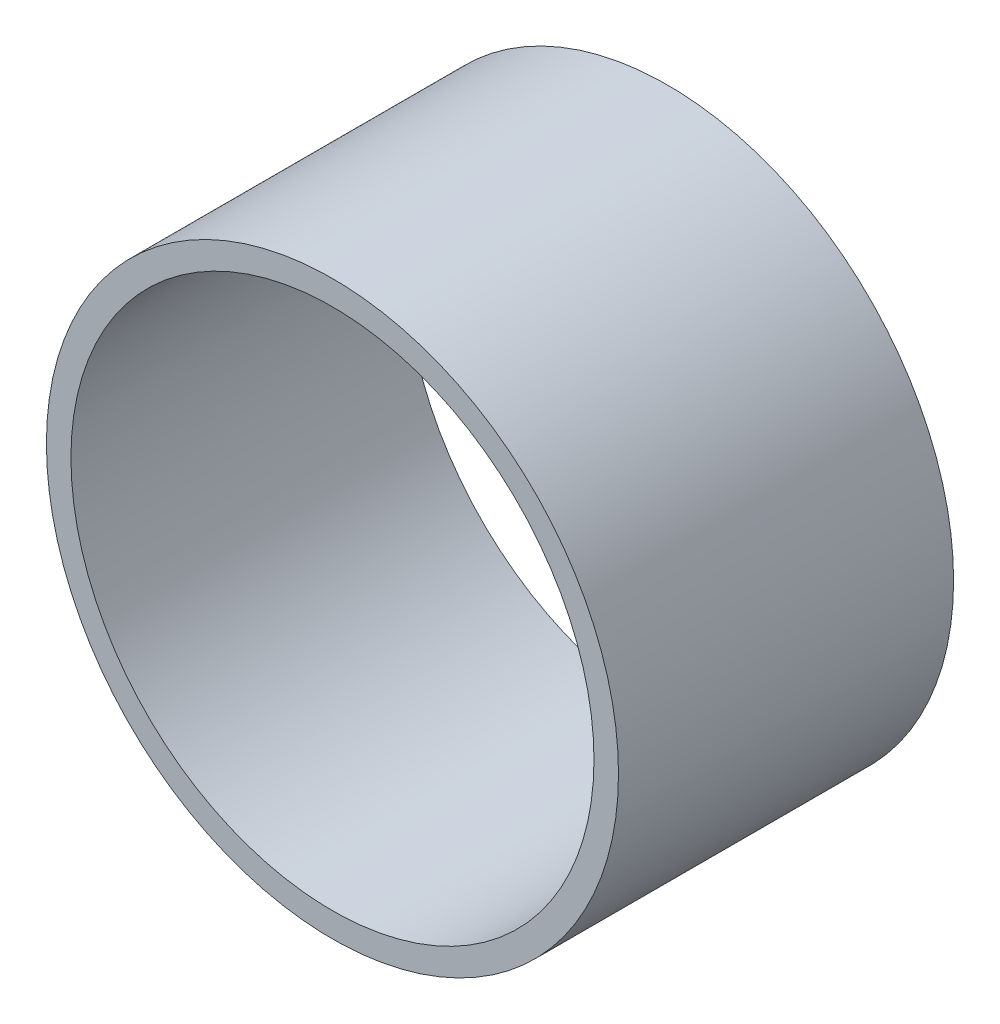
ISO-10303-21;
HEADER;
FILE_DESCRIPTION(('STEP AP214'),'2;1');
FILE_NAME('part.step','',(''),(''),'','','');
FILE_SCHEMA(('AUTOMOTIVE_DESIGN { 1 0 10303 214 1 1 1 1 }'));
ENDSEC;
DATA;
#1=APPLICATION_CONTEXT('core data for automotive mechanical design processes');
#2=APPLICATION_PROTOCOL_DEFINITION('international standard','automotive_design',2000,#1);
#3=PRODUCT_CONTEXT('',#1,'mechanical');
#4=PRODUCT('Part','Part','',(#3));
#5=PRODUCT_RELATED_PRODUCT_CATEGORY('part','',(#4));
#6=PRODUCT_DEFINITION_FORMATION('','',#4);
#7=PRODUCT_DEFINITION_CONTEXT('part definition',#1,'design');
#8=PRODUCT_DEFINITION('design','',#6,#7);
#9=PRODUCT_DEFINITION_SHAPE('','',#8);
#10=(LENGTH_UNIT() NAMED_UNIT(*) SI_UNIT(.MILLI.,.METRE.));
#11=(NAMED_UNIT(*) PLANE_ANGLE_UNIT() SI_UNIT($,.RADIAN.));
#12=(NAMED_UNIT(*) SI_UNIT($,.STERADIAN.) SOLID_ANGLE_UNIT());
#13=UNCERTAINTY_MEASURE_WITH_UNIT(LENGTH_MEASURE(1.E-05),#10,'distance_accuracy_value','');
#14=(GEOMETRIC_REPRESENTATION_CONTEXT(3) GLOBAL_UNCERTAINTY_ASSIGNED_CONTEXT((#13)) GLOBAL_UNIT_ASSIGNED_CONTEXT((#10,
#11,#12)) REPRESENTATION_CONTEXT('',''));
#15=CARTESIAN_POINT('',(0.,0.,0.));
#16=DIRECTION('',(0.,0.,1.));
#17=DIRECTION('',(1.,0.,0.));
#18=AXIS2_PLACEMENT_3D('',#15,#16,#17);
#19=CARTESIAN_POINT('',(0.,0.,-20.5));
#20=DIRECTION('',(0.,0.,1.));
#21=DIRECTION('',(1.,0.,0.));
#22=AXIS2_PLACEMENT_3D('',#19,#20,#21);
#23=CYLINDRICAL_SURFACE('',#22,35.);
#24=CARTESIAN_POINT('',(0.,0.,-20.5));
#25=DIRECTION('',(0.,0.,1.));
#26=DIRECTION('',(1.,0.,0.));
#27=AXIS2_PLACEMENT_3D('',#24,#25,#26);
#28=CIRCLE('',#27,35.);
#29=CARTESIAN_POINT('',(35.,0.,-20.5));
#30=VERTEX_POINT('',#29);
#31=EDGE_CURVE('E10',#30,#30,#28,.T.);
#32=ORIENTED_EDGE('',*,*,#31,.T.);
#33=EDGE_LOOP('',(#32));
#34=FACE_BOUND('',#33,.T.);
#35=CARTESIAN_POINT('',(0.,0.,20.5));
#36=DIRECTION('',(0.,0.,1.));
#37=DIRECTION('',(1.,0.,0.));
#38=AXIS2_PLACEMENT_3D('',#35,#36,#37);
#39=CIRCLE('',#38,35.);
#40=CARTESIAN_POINT('',(35.,0.,20.5));
#41=VERTEX_POINT('',#40);
#42=EDGE_CURVE('E44',#41,#41,#39,.T.);
#43=ORIENTED_EDGE('',*,*,#42,.F.);
#44=EDGE_LOOP('',(#43));
#45=FACE_BOUND('',#44,.T.);
#46=ADVANCED_FACE('F34',(#34,#45),#23,.T.);
#47=CARTESIAN_POINT('',(0.,0.,-20.5));
#48=DIRECTION('',(0.,0.,1.));
#49=DIRECTION('',(1.,0.,0.));
#50=AXIS2_PLACEMENT_3D('',#47,#48,#49);
#51=PLANE('',#50);
#52=CARTESIAN_POINT('',(0.,0.,-20.5));
#53=DIRECTION('',(0.,0.,1.));
#54=DIRECTION('',(1.,0.,0.));
#55=AXIS2_PLACEMENT_3D('',#52,#53,#54);
#56=CIRCLE('',#55,32.);
#57=CARTESIAN_POINT('',(32.,0.,-20.5));
#58=VERTEX_POINT('',#57);
#59=EDGE_CURVE('E40',#58,#58,#56,.T.);
#60=ORIENTED_EDGE('',*,*,#59,.T.);
#61=EDGE_LOOP('',(#60));
#62=FACE_BOUND('',#61,.T.);
#63=ORIENTED_EDGE('',*,*,#31,.F.);
#64=EDGE_LOOP('',(#63));
#65=FACE_BOUND('',#64,.T.);
#66=ADVANCED_FACE('F63',(#62,#65),#51,.F.);
#67=CARTESIAN_POINT('',(0.,0.,-20.5));
#68=DIRECTION('',(0.,0.,1.));
#69=DIRECTION('',(1.,0.,0.));
#70=AXIS2_PLACEMENT_3D('',#67,#68,#69);
#71=CYLINDRICAL_SURFACE('',#70,32.);
#72=ORIENTED_EDGE('',*,*,#59,.F.);
#73=EDGE_LOOP('',(#72));
#74=FACE_BOUND('',#73,.T.);
#75=CARTESIAN_POINT('',(0.,0.,20.5));
#76=DIRECTION('',(0.,0.,1.));
#77=DIRECTION('',(1.,0.,0.));
#78=AXIS2_PLACEMENT_3D('',#75,#76,#77);
#79=CIRCLE('',#78,32.);
#80=CARTESIAN_POINT('',(32.,0.,20.5));
#81=VERTEX_POINT('',#80);
#82=EDGE_CURVE('E48',#81,#81,#79,.T.);
#83=ORIENTED_EDGE('',*,*,#82,.T.);
#84=EDGE_LOOP('',(#83));
#85=FACE_BOUND('',#84,.T.);
#86=ADVANCED_FACE('F54',(#74,#85),#71,.F.);
#87=CARTESIAN_POINT('',(0.,0.,20.5));
#88=DIRECTION('',(0.,0.,1.));
#89=DIRECTION('',(1.,0.,0.));
#90=AXIS2_PLACEMENT_3D('',#87,#88,#89);
#91=PLANE('',#90);
#92=ORIENTED_EDGE('',*,*,#42,.T.);
#93=EDGE_LOOP('',(#92));
#94=FACE_BOUND('',#93,.T.);
#95=ORIENTED_EDGE('',*,*,#82,.F.);
#96=EDGE_LOOP('',(#95));
#97=FACE_BOUND('',#96,.T.);
#98=ADVANCED_FACE('F56',(#94,#97),#91,.T.);
#99=CLOSED_SHELL('',(#46,#66,#86,#98));
#100=MANIFOLD_SOLID_BREP('B2',#99);
#101=ADVANCED_BREP_SHAPE_REPRESENTATION('',(#18,#100),#14);
#102=SHAPE_DEFINITION_REPRESENTATION(#9,#101);
ENDSEC;
END-ISO-10303-21;
